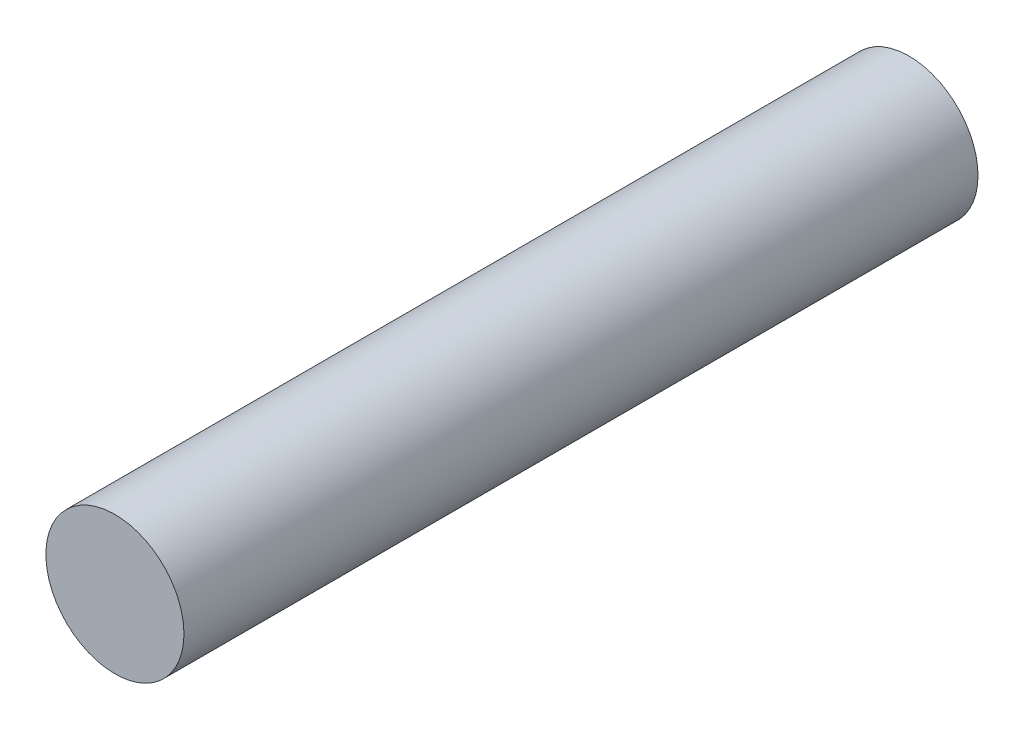
ISO-10303-21;
HEADER;
FILE_DESCRIPTION(('STEP AP214'),'2;1');
FILE_NAME('part.step','',(''),(''),'','','');
FILE_SCHEMA(('AUTOMOTIVE_DESIGN { 1 0 10303 214 1 1 1 1 }'));
ENDSEC;
DATA;
#1=APPLICATION_CONTEXT('core data for automotive mechanical design processes');
#2=APPLICATION_PROTOCOL_DEFINITION('international standard','automotive_design',2000,#1);
#3=PRODUCT_CONTEXT('',#1,'mechanical');
#4=PRODUCT('Part','Part','',(#3));
#5=PRODUCT_RELATED_PRODUCT_CATEGORY('part','',(#4));
#6=PRODUCT_DEFINITION_FORMATION('','',#4);
#7=PRODUCT_DEFINITION_CONTEXT('part definition',#1,'design');
#8=PRODUCT_DEFINITION('design','',#6,#7);
#9=PRODUCT_DEFINITION_SHAPE('','',#8);
#10=(LENGTH_UNIT() NAMED_UNIT(*) SI_UNIT(.MILLI.,.METRE.));
#11=(NAMED_UNIT(*) PLANE_ANGLE_UNIT() SI_UNIT($,.RADIAN.));
#12=(NAMED_UNIT(*) SI_UNIT($,.STERADIAN.) SOLID_ANGLE_UNIT());
#13=UNCERTAINTY_MEASURE_WITH_UNIT(LENGTH_MEASURE(1.E-05),#10,'distance_accuracy_value','');
#14=(GEOMETRIC_REPRESENTATION_CONTEXT(3) GLOBAL_UNCERTAINTY_ASSIGNED_CONTEXT((#13)) GLOBAL_UNIT_ASSIGNED_CONTEXT((#10,
#11,#12)) REPRESENTATION_CONTEXT('',''));
#15=CARTESIAN_POINT('',(0.,0.,0.));
#16=DIRECTION('',(0.,0.,1.));
#17=DIRECTION('',(1.,0.,0.));
#18=AXIS2_PLACEMENT_3D('',#15,#16,#17);
#19=CARTESIAN_POINT('',(0.,0.,46.));
#20=DIRECTION('',(0.,0.,-1.));
#21=DIRECTION('',(-1.,0.,0.));
#22=AXIS2_PLACEMENT_3D('',#19,#20,#21);
#23=CYLINDRICAL_SURFACE('',#22,4.);
#24=CARTESIAN_POINT('',(0.,0.,46.));
#25=DIRECTION('',(0.,0.,1.));
#26=DIRECTION('',(1.,0.,0.));
#27=AXIS2_PLACEMENT_3D('',#24,#25,#26);
#28=CIRCLE('',#27,4.);
#29=CARTESIAN_POINT('',(4.,0.,46.));
#30=VERTEX_POINT('',#29);
#31=EDGE_CURVE('E10',#30,#30,#28,.T.);
#32=ORIENTED_EDGE('',*,*,#31,.F.);
#33=EDGE_LOOP('',(#32));
#34=FACE_BOUND('',#33,.T.);
#35=CARTESIAN_POINT('',(0.,0.,0.));
#36=DIRECTION('',(0.,0.,1.));
#37=DIRECTION('',(1.,0.,0.));
#38=AXIS2_PLACEMENT_3D('',#35,#36,#37);
#39=CIRCLE('',#38,4.);
#40=CARTESIAN_POINT('',(4.,0.,0.));
#41=VERTEX_POINT('',#40);
#42=EDGE_CURVE('E35',#41,#41,#39,.T.);
#43=ORIENTED_EDGE('',*,*,#42,.T.);
#44=EDGE_LOOP('',(#43));
#45=FACE_BOUND('',#44,.T.);
#46=ADVANCED_FACE('F32',(#34,#45),#23,.T.);
#47=CARTESIAN_POINT('',(0.,0.,46.));
#48=DIRECTION('',(0.,0.,1.));
#49=DIRECTION('',(1.,0.,0.));
#50=AXIS2_PLACEMENT_3D('',#47,#48,#49);
#51=PLANE('',#50);
#52=ORIENTED_EDGE('',*,*,#31,.T.);
#53=EDGE_LOOP('',(#52));
#54=FACE_BOUND('',#53,.T.);
#55=ADVANCED_FACE('F47',(#54),#51,.T.);
#56=CARTESIAN_POINT('',(0.,0.,0.));
#57=DIRECTION('',(0.,0.,1.));
#58=DIRECTION('',(1.,0.,0.));
#59=AXIS2_PLACEMENT_3D('',#56,#57,#58);
#60=PLANE('',#59);
#61=ORIENTED_EDGE('',*,*,#42,.F.);
#62=EDGE_LOOP('',(#61));
#63=FACE_BOUND('',#62,.T.);
#64=ADVANCED_FACE('F45',(#63),#60,.F.);
#65=CLOSED_SHELL('',(#46,#55,#64));
#66=MANIFOLD_SOLID_BREP('B2',#65);
#67=ADVANCED_BREP_SHAPE_REPRESENTATION('',(#18,#66),#14);
#68=SHAPE_DEFINITION_REPRESENTATION(#9,#67);
ENDSEC;
END-ISO-10303-21;
